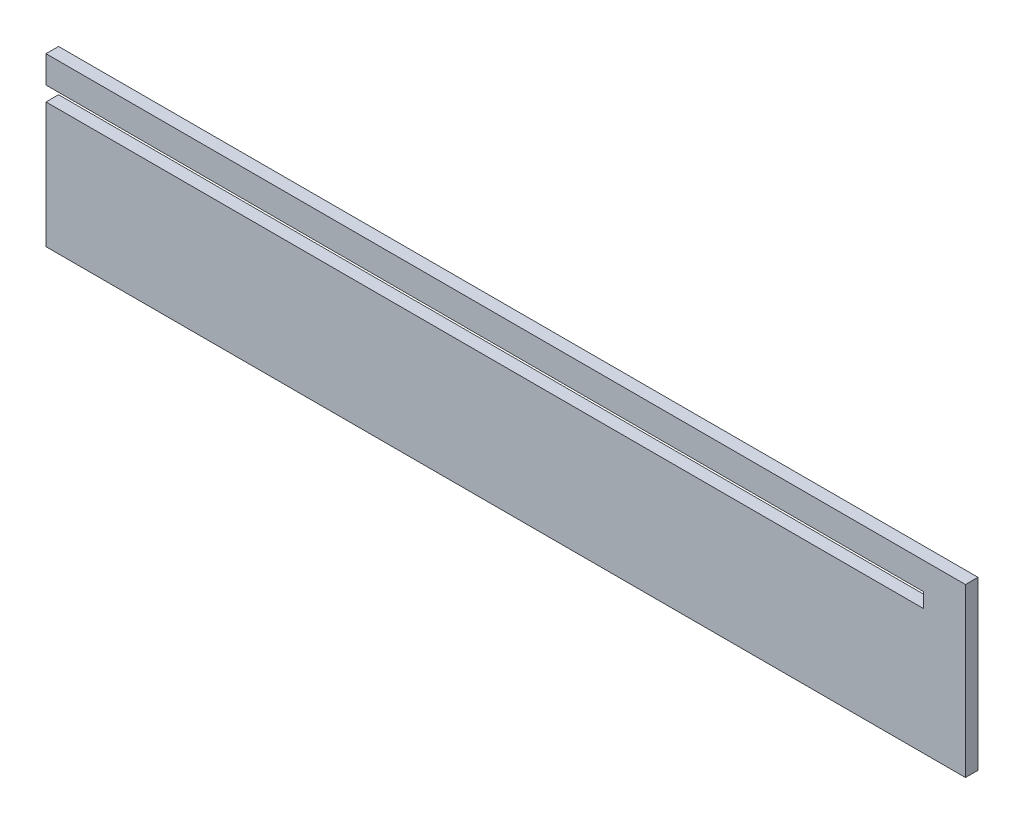
ISO-10303-21;
HEADER;
FILE_DESCRIPTION(('STEP AP214'),'2;1');
FILE_NAME('part.step','',(''),(''),'','','');
FILE_SCHEMA(('AUTOMOTIVE_DESIGN { 1 0 10303 214 1 1 1 1 }'));
ENDSEC;
DATA;
#1=APPLICATION_CONTEXT('core data for automotive mechanical design processes');
#2=APPLICATION_PROTOCOL_DEFINITION('international standard','automotive_design',2000,#1);
#3=PRODUCT_CONTEXT('',#1,'mechanical');
#4=PRODUCT('Part','Part','',(#3));
#5=PRODUCT_RELATED_PRODUCT_CATEGORY('part','',(#4));
#6=PRODUCT_DEFINITION_FORMATION('','',#4);
#7=PRODUCT_DEFINITION_CONTEXT('part definition',#1,'design');
#8=PRODUCT_DEFINITION('design','',#6,#7);
#9=PRODUCT_DEFINITION_SHAPE('','',#8);
#10=(LENGTH_UNIT() NAMED_UNIT(*) SI_UNIT(.MILLI.,.METRE.));
#11=(NAMED_UNIT(*) PLANE_ANGLE_UNIT() SI_UNIT($,.RADIAN.));
#12=(NAMED_UNIT(*) SI_UNIT($,.STERADIAN.) SOLID_ANGLE_UNIT());
#13=UNCERTAINTY_MEASURE_WITH_UNIT(LENGTH_MEASURE(1.E-05),#10,'distance_accuracy_value','');
#14=(GEOMETRIC_REPRESENTATION_CONTEXT(3) GLOBAL_UNCERTAINTY_ASSIGNED_CONTEXT((#13)) GLOBAL_UNIT_ASSIGNED_CONTEXT((#10,
#11,#12)) REPRESENTATION_CONTEXT('',''));
#15=CARTESIAN_POINT('',(0.,0.,0.));
#16=DIRECTION('',(0.,0.,1.));
#17=DIRECTION('',(1.,0.,0.));
#18=AXIS2_PLACEMENT_3D('',#15,#16,#17);
#19=CARTESIAN_POINT('',(0.,33.5,3.));
#20=DIRECTION('',(0.,1.,0.));
#21=DIRECTION('',(0.,0.,1.));
#22=AXIS2_PLACEMENT_3D('',#19,#20,#21);
#23=PLANE('',#22);
#24=DIRECTION('',(1.,0.,0.));
#25=VECTOR('',#24,1.);
#26=CARTESIAN_POINT('',(0.,33.5,0.));
#27=LINE('',#26,#25);
#28=CARTESIAN_POINT('',(0.,33.5,0.));
#29=VERTEX_POINT('',#28);
#30=CARTESIAN_POINT('',(210.,33.5,0.));
#31=VERTEX_POINT('',#30);
#32=EDGE_CURVE('E134',#29,#31,#27,.T.);
#33=ORIENTED_EDGE('',*,*,#32,.T.);
#34=DIRECTION('',(0.,0.,-1.));
#35=VECTOR('',#34,1.);
#36=CARTESIAN_POINT('',(210.,33.5,3.));
#37=LINE('',#36,#35);
#38=CARTESIAN_POINT('',(210.,33.5,3.));
#39=VERTEX_POINT('',#38);
#40=EDGE_CURVE('E11',#39,#31,#37,.T.);
#41=ORIENTED_EDGE('',*,*,#40,.F.);
#42=DIRECTION('',(1.,0.,0.));
#43=VECTOR('',#42,1.);
#44=CARTESIAN_POINT('',(0.,33.5,3.));
#45=LINE('',#44,#43);
#46=CARTESIAN_POINT('',(0.,33.5,3.));
#47=VERTEX_POINT('',#46);
#48=EDGE_CURVE('E173',#47,#39,#45,.T.);
#49=ORIENTED_EDGE('',*,*,#48,.F.);
#50=DIRECTION('',(0.,0.,-1.));
#51=VECTOR('',#50,1.);
#52=CARTESIAN_POINT('',(0.,33.5,3.));
#53=LINE('',#52,#51);
#54=EDGE_CURVE('E51',#47,#29,#53,.T.);
#55=ORIENTED_EDGE('',*,*,#54,.T.);
#56=EDGE_LOOP('',(#33,#41,#49,#55));
#57=FACE_BOUND('',#56,.T.);
#58=ADVANCED_FACE('F35',(#57),#23,.F.);
#59=CARTESIAN_POINT('',(210.,0.,3.));
#60=DIRECTION('',(1.,0.,0.));
#61=DIRECTION('',(0.,0.,-1.));
#62=AXIS2_PLACEMENT_3D('',#59,#60,#61);
#63=PLANE('',#62);
#64=DIRECTION('',(0.,-1.,0.));
#65=VECTOR('',#64,1.);
#66=CARTESIAN_POINT('',(210.,0.,0.));
#67=LINE('',#66,#65);
#68=CARTESIAN_POINT('',(210.,30.,0.));
#69=VERTEX_POINT('',#68);
#70=EDGE_CURVE('E136',#31,#69,#67,.T.);
#71=ORIENTED_EDGE('',*,*,#70,.T.);
#72=DIRECTION('',(0.,0.,-1.));
#73=VECTOR('',#72,1.);
#74=CARTESIAN_POINT('',(210.,30.,3.));
#75=LINE('',#74,#73);
#76=CARTESIAN_POINT('',(210.,30.,3.));
#77=VERTEX_POINT('',#76);
#78=EDGE_CURVE('E43',#77,#69,#75,.T.);
#79=ORIENTED_EDGE('',*,*,#78,.F.);
#80=DIRECTION('',(0.,-1.,0.));
#81=VECTOR('',#80,1.);
#82=CARTESIAN_POINT('',(210.,0.,3.));
#83=LINE('',#82,#81);
#84=EDGE_CURVE('E89',#39,#77,#83,.T.);
#85=ORIENTED_EDGE('',*,*,#84,.F.);
#86=ORIENTED_EDGE('',*,*,#40,.T.);
#87=EDGE_LOOP('',(#71,#79,#85,#86));
#88=FACE_BOUND('',#87,.T.);
#89=ADVANCED_FACE('F163',(#88),#63,.F.);
#90=CARTESIAN_POINT('',(0.,30.,3.));
#91=DIRECTION('',(0.,1.,0.));
#92=DIRECTION('',(0.,0.,1.));
#93=AXIS2_PLACEMENT_3D('',#90,#91,#92);
#94=PLANE('',#93);
#95=DIRECTION('',(1.,0.,0.));
#96=VECTOR('',#95,1.);
#97=CARTESIAN_POINT('',(0.,30.,0.));
#98=LINE('',#97,#96);
#99=CARTESIAN_POINT('',(0.,30.,0.));
#100=VERTEX_POINT('',#99);
#101=EDGE_CURVE('E139',#100,#69,#98,.T.);
#102=ORIENTED_EDGE('',*,*,#101,.F.);
#103=DIRECTION('',(0.,0.,-1.));
#104=VECTOR('',#103,1.);
#105=CARTESIAN_POINT('',(0.,30.,3.));
#106=LINE('',#105,#104);
#107=CARTESIAN_POINT('',(0.,30.,3.));
#108=VERTEX_POINT('',#107);
#109=EDGE_CURVE('E156',#108,#100,#106,.T.);
#110=ORIENTED_EDGE('',*,*,#109,.F.);
#111=DIRECTION('',(1.,0.,0.));
#112=VECTOR('',#111,1.);
#113=CARTESIAN_POINT('',(0.,30.,3.));
#114=LINE('',#113,#112);
#115=EDGE_CURVE('E162',#108,#77,#114,.T.);
#116=ORIENTED_EDGE('',*,*,#115,.T.);
#117=ORIENTED_EDGE('',*,*,#78,.T.);
#118=EDGE_LOOP('',(#102,#110,#116,#117));
#119=FACE_BOUND('',#118,.T.);
#120=ADVANCED_FACE('F160',(#119),#94,.T.);
#121=CARTESIAN_POINT('',(0.,0.,3.));
#122=DIRECTION('',(-1.,0.,0.));
#123=DIRECTION('',(0.,0.,1.));
#124=AXIS2_PLACEMENT_3D('',#121,#122,#123);
#125=PLANE('',#124);
#126=DIRECTION('',(0.,1.,0.));
#127=VECTOR('',#126,1.);
#128=CARTESIAN_POINT('',(0.,0.,0.));
#129=LINE('',#128,#127);
#130=CARTESIAN_POINT('',(0.,0.,0.));
#131=VERTEX_POINT('',#130);
#132=EDGE_CURVE('E142',#131,#100,#129,.T.);
#133=ORIENTED_EDGE('',*,*,#132,.F.);
#134=DIRECTION('',(0.,0.,-1.));
#135=VECTOR('',#134,1.);
#136=CARTESIAN_POINT('',(0.,0.,3.));
#137=LINE('',#136,#135);
#138=CARTESIAN_POINT('',(0.,0.,3.));
#139=VERTEX_POINT('',#138);
#140=EDGE_CURVE('E154',#139,#131,#137,.T.);
#141=ORIENTED_EDGE('',*,*,#140,.F.);
#142=DIRECTION('',(0.,1.,0.));
#143=VECTOR('',#142,1.);
#144=CARTESIAN_POINT('',(0.,0.,3.));
#145=LINE('',#144,#143);
#146=EDGE_CURVE('E131',#139,#108,#145,.T.);
#147=ORIENTED_EDGE('',*,*,#146,.T.);
#148=ORIENTED_EDGE('',*,*,#109,.T.);
#149=EDGE_LOOP('',(#133,#141,#147,#148));
#150=FACE_BOUND('',#149,.T.);
#151=ADVANCED_FACE('F170',(#150),#125,.T.);
#152=CARTESIAN_POINT('',(0.,0.,3.));
#153=DIRECTION('',(0.,1.,0.));
#154=DIRECTION('',(0.,0.,1.));
#155=AXIS2_PLACEMENT_3D('',#152,#153,#154);
#156=PLANE('',#155);
#157=DIRECTION('',(1.,0.,0.));
#158=VECTOR('',#157,1.);
#159=CARTESIAN_POINT('',(0.,0.,0.));
#160=LINE('',#159,#158);
#161=CARTESIAN_POINT('',(220.,0.,0.));
#162=VERTEX_POINT('',#161);
#163=EDGE_CURVE('E145',#131,#162,#160,.T.);
#164=ORIENTED_EDGE('',*,*,#163,.T.);
#165=DIRECTION('',(0.,0.,-1.));
#166=VECTOR('',#165,1.);
#167=CARTESIAN_POINT('',(220.,0.,3.));
#168=LINE('',#167,#166);
#169=CARTESIAN_POINT('',(220.,0.,3.));
#170=VERTEX_POINT('',#169);
#171=EDGE_CURVE('E125',#170,#162,#168,.T.);
#172=ORIENTED_EDGE('',*,*,#171,.F.);
#173=DIRECTION('',(1.,0.,0.));
#174=VECTOR('',#173,1.);
#175=CARTESIAN_POINT('',(0.,0.,3.));
#176=LINE('',#175,#174);
#177=EDGE_CURVE('E113',#139,#170,#176,.T.);
#178=ORIENTED_EDGE('',*,*,#177,.F.);
#179=ORIENTED_EDGE('',*,*,#140,.T.);
#180=EDGE_LOOP('',(#164,#172,#178,#179));
#181=FACE_BOUND('',#180,.T.);
#182=ADVANCED_FACE('F188',(#181),#156,.F.);
#183=CARTESIAN_POINT('',(220.,0.,3.));
#184=DIRECTION('',(-1.,0.,0.));
#185=DIRECTION('',(0.,0.,1.));
#186=AXIS2_PLACEMENT_3D('',#183,#184,#185);
#187=PLANE('',#186);
#188=DIRECTION('',(0.,1.,0.));
#189=VECTOR('',#188,1.);
#190=CARTESIAN_POINT('',(220.,0.,0.));
#191=LINE('',#190,#189);
#192=CARTESIAN_POINT('',(220.,40.,0.));
#193=VERTEX_POINT('',#192);
#194=EDGE_CURVE('E122',#162,#193,#191,.T.);
#195=ORIENTED_EDGE('',*,*,#194,.T.);
#196=DIRECTION('',(0.,0.,-1.));
#197=VECTOR('',#196,1.);
#198=CARTESIAN_POINT('',(220.,40.,3.));
#199=LINE('',#198,#197);
#200=CARTESIAN_POINT('',(220.,40.,3.));
#201=VERTEX_POINT('',#200);
#202=EDGE_CURVE('E119',#201,#193,#199,.T.);
#203=ORIENTED_EDGE('',*,*,#202,.F.);
#204=DIRECTION('',(0.,1.,0.));
#205=VECTOR('',#204,1.);
#206=CARTESIAN_POINT('',(220.,0.,3.));
#207=LINE('',#206,#205);
#208=EDGE_CURVE('E105',#170,#201,#207,.T.);
#209=ORIENTED_EDGE('',*,*,#208,.F.);
#210=ORIENTED_EDGE('',*,*,#171,.T.);
#211=EDGE_LOOP('',(#195,#203,#209,#210));
#212=FACE_BOUND('',#211,.T.);
#213=ADVANCED_FACE('F120',(#212),#187,.F.);
#214=CARTESIAN_POINT('',(0.,40.,3.));
#215=DIRECTION('',(0.,1.,0.));
#216=DIRECTION('',(0.,0.,1.));
#217=AXIS2_PLACEMENT_3D('',#214,#215,#216);
#218=PLANE('',#217);
#219=DIRECTION('',(1.,0.,0.));
#220=VECTOR('',#219,1.);
#221=CARTESIAN_POINT('',(0.,40.,0.));
#222=LINE('',#221,#220);
#223=CARTESIAN_POINT('',(0.,40.,0.));
#224=VERTEX_POINT('',#223);
#225=EDGE_CURVE('E149',#224,#193,#222,.T.);
#226=ORIENTED_EDGE('',*,*,#225,.F.);
#227=DIRECTION('',(0.,0.,-1.));
#228=VECTOR('',#227,1.);
#229=CARTESIAN_POINT('',(0.,40.,3.));
#230=LINE('',#229,#228);
#231=CARTESIAN_POINT('',(0.,40.,3.));
#232=VERTEX_POINT('',#231);
#233=EDGE_CURVE('E77',#232,#224,#230,.T.);
#234=ORIENTED_EDGE('',*,*,#233,.F.);
#235=DIRECTION('',(1.,0.,0.));
#236=VECTOR('',#235,1.);
#237=CARTESIAN_POINT('',(0.,40.,3.));
#238=LINE('',#237,#236);
#239=EDGE_CURVE('E110',#232,#201,#238,.T.);
#240=ORIENTED_EDGE('',*,*,#239,.T.);
#241=ORIENTED_EDGE('',*,*,#202,.T.);
#242=EDGE_LOOP('',(#226,#234,#240,#241));
#243=FACE_BOUND('',#242,.T.);
#244=ADVANCED_FACE('F127',(#243),#218,.T.);
#245=EDGE_CURVE('E146',#29,#224,#129,.T.);
#246=ORIENTED_EDGE('',*,*,#245,.F.);
#247=ORIENTED_EDGE('',*,*,#54,.F.);
#248=EDGE_CURVE('E128',#47,#232,#145,.T.);
#249=ORIENTED_EDGE('',*,*,#248,.T.);
#250=ORIENTED_EDGE('',*,*,#233,.T.);
#251=EDGE_LOOP('',(#246,#247,#249,#250));
#252=FACE_BOUND('',#251,.T.);
#253=ADVANCED_FACE('F177',(#252),#125,.T.);
#254=CARTESIAN_POINT('',(0.,0.,3.));
#255=DIRECTION('',(0.,0.,1.));
#256=DIRECTION('',(1.,0.,0.));
#257=AXIS2_PLACEMENT_3D('',#254,#255,#256);
#258=PLANE('',#257);
#259=ORIENTED_EDGE('',*,*,#48,.T.);
#260=ORIENTED_EDGE('',*,*,#84,.T.);
#261=ORIENTED_EDGE('',*,*,#115,.F.);
#262=ORIENTED_EDGE('',*,*,#146,.F.);
#263=ORIENTED_EDGE('',*,*,#177,.T.);
#264=ORIENTED_EDGE('',*,*,#208,.T.);
#265=ORIENTED_EDGE('',*,*,#239,.F.);
#266=ORIENTED_EDGE('',*,*,#248,.F.);
#267=EDGE_LOOP('',(#259,#260,#261,#262,#263,#264,#265,#266));
#268=FACE_BOUND('',#267,.T.);
#269=ADVANCED_FACE('F107',(#268),#258,.T.);
#270=CARTESIAN_POINT('',(0.,0.,0.));
#271=DIRECTION('',(0.,0.,1.));
#272=DIRECTION('',(1.,0.,0.));
#273=AXIS2_PLACEMENT_3D('',#270,#271,#272);
#274=PLANE('',#273);
#275=ORIENTED_EDGE('',*,*,#32,.F.);
#276=ORIENTED_EDGE('',*,*,#245,.T.);
#277=ORIENTED_EDGE('',*,*,#225,.T.);
#278=ORIENTED_EDGE('',*,*,#194,.F.);
#279=ORIENTED_EDGE('',*,*,#163,.F.);
#280=ORIENTED_EDGE('',*,*,#132,.T.);
#281=ORIENTED_EDGE('',*,*,#101,.T.);
#282=ORIENTED_EDGE('',*,*,#70,.F.);
#283=EDGE_LOOP('',(#275,#276,#277,#278,#279,#280,#281,#282));
#284=FACE_BOUND('',#283,.T.);
#285=ADVANCED_FACE('F166',(#284),#274,.F.);
#286=CLOSED_SHELL('',(#58,#89,#120,#151,#182,#213,#244,#253,#269,#285));
#287=MANIFOLD_SOLID_BREP('B2',#286);
#288=ADVANCED_BREP_SHAPE_REPRESENTATION('',(#18,#287),#14);
#289=SHAPE_DEFINITION_REPRESENTATION(#9,#288);
ENDSEC;
END-ISO-10303-21;
